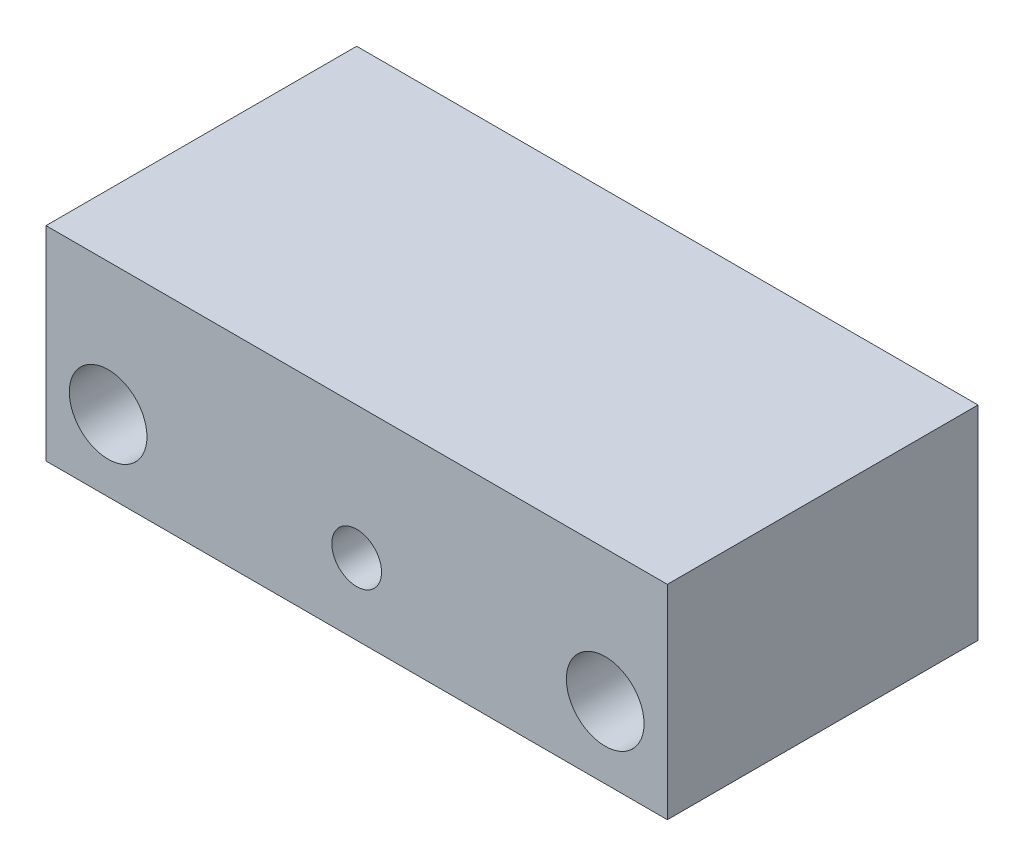
ISO-10303-21;
HEADER;
FILE_DESCRIPTION(('STEP AP214'),'2;1');
FILE_NAME('part.step','',(''),(''),'','','');
FILE_SCHEMA(('AUTOMOTIVE_DESIGN { 1 0 10303 214 1 1 1 1 }'));
ENDSEC;
DATA;
#1=APPLICATION_CONTEXT('core data for automotive mechanical design processes');
#2=APPLICATION_PROTOCOL_DEFINITION('international standard','automotive_design',2000,#1);
#3=PRODUCT_CONTEXT('',#1,'mechanical');
#4=PRODUCT('Part','Part','',(#3));
#5=PRODUCT_RELATED_PRODUCT_CATEGORY('part','',(#4));
#6=PRODUCT_DEFINITION_FORMATION('','',#4);
#7=PRODUCT_DEFINITION_CONTEXT('part definition',#1,'design');
#8=PRODUCT_DEFINITION('design','',#6,#7);
#9=PRODUCT_DEFINITION_SHAPE('','',#8);
#10=(LENGTH_UNIT() NAMED_UNIT(*) SI_UNIT(.MILLI.,.METRE.));
#11=(NAMED_UNIT(*) PLANE_ANGLE_UNIT() SI_UNIT($,.RADIAN.));
#12=(NAMED_UNIT(*) SI_UNIT($,.STERADIAN.) SOLID_ANGLE_UNIT());
#13=UNCERTAINTY_MEASURE_WITH_UNIT(LENGTH_MEASURE(1.E-05),#10,'distance_accuracy_value','');
#14=(GEOMETRIC_REPRESENTATION_CONTEXT(3) GLOBAL_UNCERTAINTY_ASSIGNED_CONTEXT((#13)) GLOBAL_UNIT_ASSIGNED_CONTEXT((#10,
#11,#12)) REPRESENTATION_CONTEXT('',''));
#15=CARTESIAN_POINT('',(0.,0.,0.));
#16=DIRECTION('',(0.,0.,1.));
#17=DIRECTION('',(1.,0.,0.));
#18=AXIS2_PLACEMENT_3D('',#15,#16,#17);
#19=CARTESIAN_POINT('',(0.,0.,100.));
#20=DIRECTION('',(0.,0.,-1.));
#21=DIRECTION('',(-1.,0.,0.));
#22=AXIS2_PLACEMENT_3D('',#19,#20,#21);
#23=PLANE('',#22);
#24=CARTESIAN_POINT('',(100.,23.,100.));
#25=DIRECTION('',(0.,0.,1.));
#26=DIRECTION('',(1.,0.,0.));
#27=AXIS2_PLACEMENT_3D('',#24,#25,#26);
#28=CIRCLE('',#27,8.00000000000001);
#29=CARTESIAN_POINT('',(108.,23.,100.));
#30=VERTEX_POINT('',#29);
#31=EDGE_CURVE('E118',#30,#30,#28,.T.);
#32=ORIENTED_EDGE('',*,*,#31,.F.);
#33=EDGE_LOOP('',(#32));
#34=FACE_BOUND('',#33,.T.);
#35=DIRECTION('',(0.,-1.,0.));
#36=VECTOR('',#35,1.);
#37=CARTESIAN_POINT('',(0.,0.,100.));
#38=LINE('',#37,#36);
#39=CARTESIAN_POINT('',(0.,65.63,100.));
#40=VERTEX_POINT('',#39);
#41=CARTESIAN_POINT('',(0.,0.,100.));
#42=VERTEX_POINT('',#41);
#43=EDGE_CURVE('E88',#40,#42,#38,.T.);
#44=ORIENTED_EDGE('',*,*,#43,.T.);
#45=DIRECTION('',(1.,0.,0.));
#46=VECTOR('',#45,1.);
#47=CARTESIAN_POINT('',(0.,0.,100.));
#48=LINE('',#47,#46);
#49=CARTESIAN_POINT('',(200.,0.,100.));
#50=VERTEX_POINT('',#49);
#51=EDGE_CURVE('E83',#42,#50,#48,.T.);
#52=ORIENTED_EDGE('',*,*,#51,.T.);
#53=DIRECTION('',(0.,1.,0.));
#54=VECTOR('',#53,1.);
#55=CARTESIAN_POINT('',(200.,0.,100.));
#56=LINE('',#55,#54);
#57=CARTESIAN_POINT('',(200.,65.63,100.));
#58=VERTEX_POINT('',#57);
#59=EDGE_CURVE('E86',#50,#58,#56,.T.);
#60=ORIENTED_EDGE('',*,*,#59,.T.);
#61=DIRECTION('',(-1.,0.,0.));
#62=VECTOR('',#61,1.);
#63=CARTESIAN_POINT('',(0.,65.63,100.));
#64=LINE('',#63,#62);
#65=EDGE_CURVE('E53',#58,#40,#64,.T.);
#66=ORIENTED_EDGE('',*,*,#65,.T.);
#67=EDGE_LOOP('',(#44,#52,#60,#66));
#68=FACE_BOUND('',#67,.T.);
#69=CARTESIAN_POINT('',(20.,23.,100.));
#70=DIRECTION('',(0.,0.,1.));
#71=DIRECTION('',(1.,0.,0.));
#72=AXIS2_PLACEMENT_3D('',#69,#70,#71);
#73=CIRCLE('',#72,12.5);
#74=CARTESIAN_POINT('',(32.5,23.,100.));
#75=VERTEX_POINT('',#74);
#76=EDGE_CURVE('E103',#75,#75,#73,.T.);
#77=ORIENTED_EDGE('',*,*,#76,.F.);
#78=EDGE_LOOP('',(#77));
#79=FACE_BOUND('',#78,.T.);
#80=CARTESIAN_POINT('',(180.,23.,100.));
#81=DIRECTION('',(0.,0.,1.));
#82=DIRECTION('',(1.,0.,0.));
#83=AXIS2_PLACEMENT_3D('',#80,#81,#82);
#84=CIRCLE('',#83,12.5);
#85=CARTESIAN_POINT('',(192.5,23.,100.));
#86=VERTEX_POINT('',#85);
#87=EDGE_CURVE('E124',#86,#86,#84,.T.);
#88=ORIENTED_EDGE('',*,*,#87,.F.);
#89=EDGE_LOOP('',(#88));
#90=FACE_BOUND('',#89,.T.);
#91=ADVANCED_FACE('F36',(#34,#68,#79,#90),#23,.F.);
#92=CARTESIAN_POINT('',(0.,0.,0.));
#93=DIRECTION('',(0.,0.,-1.));
#94=DIRECTION('',(-1.,0.,0.));
#95=AXIS2_PLACEMENT_3D('',#92,#93,#94);
#96=PLANE('',#95);
#97=CARTESIAN_POINT('',(100.,23.,0.));
#98=DIRECTION('',(0.,0.,1.));
#99=DIRECTION('',(1.,0.,0.));
#100=AXIS2_PLACEMENT_3D('',#97,#98,#99);
#101=CIRCLE('',#100,8.00000000000001);
#102=CARTESIAN_POINT('',(108.,23.,0.));
#103=VERTEX_POINT('',#102);
#104=EDGE_CURVE('E121',#103,#103,#101,.T.);
#105=ORIENTED_EDGE('',*,*,#104,.T.);
#106=EDGE_LOOP('',(#105));
#107=FACE_BOUND('',#106,.T.);
#108=DIRECTION('',(0.,-1.,0.));
#109=VECTOR('',#108,1.);
#110=CARTESIAN_POINT('',(0.,0.,0.));
#111=LINE('',#110,#109);
#112=CARTESIAN_POINT('',(0.,65.63,0.));
#113=VERTEX_POINT('',#112);
#114=CARTESIAN_POINT('',(0.,0.,0.));
#115=VERTEX_POINT('',#114);
#116=EDGE_CURVE('E100',#113,#115,#111,.T.);
#117=ORIENTED_EDGE('',*,*,#116,.F.);
#118=DIRECTION('',(-1.,0.,0.));
#119=VECTOR('',#118,1.);
#120=CARTESIAN_POINT('',(0.,65.63,0.));
#121=LINE('',#120,#119);
#122=CARTESIAN_POINT('',(200.,65.63,0.));
#123=VERTEX_POINT('',#122);
#124=EDGE_CURVE('E76',#123,#113,#121,.T.);
#125=ORIENTED_EDGE('',*,*,#124,.F.);
#126=DIRECTION('',(0.,1.,0.));
#127=VECTOR('',#126,1.);
#128=CARTESIAN_POINT('',(200.,0.,0.));
#129=LINE('',#128,#127);
#130=CARTESIAN_POINT('',(200.,0.,0.));
#131=VERTEX_POINT('',#130);
#132=EDGE_CURVE('E70',#131,#123,#129,.T.);
#133=ORIENTED_EDGE('',*,*,#132,.F.);
#134=DIRECTION('',(1.,0.,0.));
#135=VECTOR('',#134,1.);
#136=CARTESIAN_POINT('',(0.,0.,0.));
#137=LINE('',#136,#135);
#138=EDGE_CURVE('E92',#115,#131,#137,.T.);
#139=ORIENTED_EDGE('',*,*,#138,.F.);
#140=EDGE_LOOP('',(#117,#125,#133,#139));
#141=FACE_BOUND('',#140,.T.);
#142=CARTESIAN_POINT('',(20.,23.,0.));
#143=DIRECTION('',(0.,0.,1.));
#144=DIRECTION('',(1.,0.,0.));
#145=AXIS2_PLACEMENT_3D('',#142,#143,#144);
#146=CIRCLE('',#145,12.5);
#147=CARTESIAN_POINT('',(32.5,23.,0.));
#148=VERTEX_POINT('',#147);
#149=EDGE_CURVE('E115',#148,#148,#146,.T.);
#150=ORIENTED_EDGE('',*,*,#149,.T.);
#151=EDGE_LOOP('',(#150));
#152=FACE_BOUND('',#151,.T.);
#153=CARTESIAN_POINT('',(180.,23.,0.));
#154=DIRECTION('',(0.,0.,1.));
#155=DIRECTION('',(1.,0.,0.));
#156=AXIS2_PLACEMENT_3D('',#153,#154,#155);
#157=CIRCLE('',#156,12.5);
#158=CARTESIAN_POINT('',(192.5,23.,0.));
#159=VERTEX_POINT('',#158);
#160=EDGE_CURVE('E127',#159,#159,#157,.T.);
#161=ORIENTED_EDGE('',*,*,#160,.T.);
#162=EDGE_LOOP('',(#161));
#163=FACE_BOUND('',#162,.T.);
#164=ADVANCED_FACE('F111',(#107,#141,#152,#163),#96,.T.);
#165=CARTESIAN_POINT('',(0.,0.,100.));
#166=DIRECTION('',(1.,0.,0.));
#167=DIRECTION('',(0.,0.,-1.));
#168=AXIS2_PLACEMENT_3D('',#165,#166,#167);
#169=PLANE('',#168);
#170=ORIENTED_EDGE('',*,*,#116,.T.);
#171=DIRECTION('',(0.,0.,-1.));
#172=VECTOR('',#171,1.);
#173=CARTESIAN_POINT('',(0.,0.,100.));
#174=LINE('',#173,#172);
#175=EDGE_CURVE('E11',#42,#115,#174,.T.);
#176=ORIENTED_EDGE('',*,*,#175,.F.);
#177=ORIENTED_EDGE('',*,*,#43,.F.);
#178=DIRECTION('',(0.,0.,-1.));
#179=VECTOR('',#178,1.);
#180=CARTESIAN_POINT('',(0.,65.63,100.));
#181=LINE('',#180,#179);
#182=EDGE_CURVE('E96',#40,#113,#181,.T.);
#183=ORIENTED_EDGE('',*,*,#182,.T.);
#184=EDGE_LOOP('',(#170,#176,#177,#183));
#185=FACE_BOUND('',#184,.T.);
#186=ADVANCED_FACE('F38',(#185),#169,.F.);
#187=CARTESIAN_POINT('',(0.,0.,100.));
#188=DIRECTION('',(0.,1.,0.));
#189=DIRECTION('',(0.,0.,1.));
#190=AXIS2_PLACEMENT_3D('',#187,#188,#189);
#191=PLANE('',#190);
#192=ORIENTED_EDGE('',*,*,#138,.T.);
#193=DIRECTION('',(0.,0.,-1.));
#194=VECTOR('',#193,1.);
#195=CARTESIAN_POINT('',(200.,0.,100.));
#196=LINE('',#195,#194);
#197=EDGE_CURVE('E45',#50,#131,#196,.T.);
#198=ORIENTED_EDGE('',*,*,#197,.F.);
#199=ORIENTED_EDGE('',*,*,#51,.F.);
#200=ORIENTED_EDGE('',*,*,#175,.T.);
#201=EDGE_LOOP('',(#192,#198,#199,#200));
#202=FACE_BOUND('',#201,.T.);
#203=ADVANCED_FACE('F91',(#202),#191,.F.);
#204=CARTESIAN_POINT('',(200.,0.,100.));
#205=DIRECTION('',(-1.,0.,0.));
#206=DIRECTION('',(0.,0.,1.));
#207=AXIS2_PLACEMENT_3D('',#204,#205,#206);
#208=PLANE('',#207);
#209=ORIENTED_EDGE('',*,*,#132,.T.);
#210=DIRECTION('',(0.,0.,-1.));
#211=VECTOR('',#210,1.);
#212=CARTESIAN_POINT('',(200.,65.63,100.));
#213=LINE('',#212,#211);
#214=EDGE_CURVE('E93',#58,#123,#213,.T.);
#215=ORIENTED_EDGE('',*,*,#214,.F.);
#216=ORIENTED_EDGE('',*,*,#59,.F.);
#217=ORIENTED_EDGE('',*,*,#197,.T.);
#218=EDGE_LOOP('',(#209,#215,#216,#217));
#219=FACE_BOUND('',#218,.T.);
#220=ADVANCED_FACE('F94',(#219),#208,.F.);
#221=CARTESIAN_POINT('',(0.,65.63,100.));
#222=DIRECTION('',(0.,-1.,0.));
#223=DIRECTION('',(0.,0.,-1.));
#224=AXIS2_PLACEMENT_3D('',#221,#222,#223);
#225=PLANE('',#224);
#226=ORIENTED_EDGE('',*,*,#124,.T.);
#227=ORIENTED_EDGE('',*,*,#182,.F.);
#228=ORIENTED_EDGE('',*,*,#65,.F.);
#229=ORIENTED_EDGE('',*,*,#214,.T.);
#230=EDGE_LOOP('',(#226,#227,#228,#229));
#231=FACE_BOUND('',#230,.T.);
#232=ADVANCED_FACE('F108',(#231),#225,.F.);
#233=CARTESIAN_POINT('',(20.,23.,100.));
#234=DIRECTION('',(0.,0.,-1.));
#235=DIRECTION('',(-1.,0.,0.));
#236=AXIS2_PLACEMENT_3D('',#233,#234,#235);
#237=CYLINDRICAL_SURFACE('',#236,12.5);
#238=ORIENTED_EDGE('',*,*,#76,.T.);
#239=EDGE_LOOP('',(#238));
#240=FACE_BOUND('',#239,.T.);
#241=ORIENTED_EDGE('',*,*,#149,.F.);
#242=EDGE_LOOP('',(#241));
#243=FACE_BOUND('',#242,.T.);
#244=ADVANCED_FACE('F146',(#240,#243),#237,.F.);
#245=CARTESIAN_POINT('',(100.,23.,100.));
#246=DIRECTION('',(0.,0.,-1.));
#247=DIRECTION('',(-1.,0.,0.));
#248=AXIS2_PLACEMENT_3D('',#245,#246,#247);
#249=CYLINDRICAL_SURFACE('',#248,8.00000000000001);
#250=ORIENTED_EDGE('',*,*,#31,.T.);
#251=EDGE_LOOP('',(#250));
#252=FACE_BOUND('',#251,.T.);
#253=ORIENTED_EDGE('',*,*,#104,.F.);
#254=EDGE_LOOP('',(#253));
#255=FACE_BOUND('',#254,.T.);
#256=ADVANCED_FACE('F185',(#252,#255),#249,.F.);
#257=CARTESIAN_POINT('',(180.,23.,100.));
#258=DIRECTION('',(0.,0.,-1.));
#259=DIRECTION('',(-1.,0.,0.));
#260=AXIS2_PLACEMENT_3D('',#257,#258,#259);
#261=CYLINDRICAL_SURFACE('',#260,12.5);
#262=ORIENTED_EDGE('',*,*,#87,.T.);
#263=EDGE_LOOP('',(#262));
#264=FACE_BOUND('',#263,.T.);
#265=ORIENTED_EDGE('',*,*,#160,.F.);
#266=EDGE_LOOP('',(#265));
#267=FACE_BOUND('',#266,.T.);
#268=ADVANCED_FACE('F133',(#264,#267),#261,.F.);
#269=CLOSED_SHELL('',(#91,#164,#186,#203,#220,#232,#244,#256,#268));
#270=MANIFOLD_SOLID_BREP('B2',#269);
#271=ADVANCED_BREP_SHAPE_REPRESENTATION('',(#18,#270),#14);
#272=SHAPE_DEFINITION_REPRESENTATION(#9,#271);
ENDSEC;
END-ISO-10303-21;
